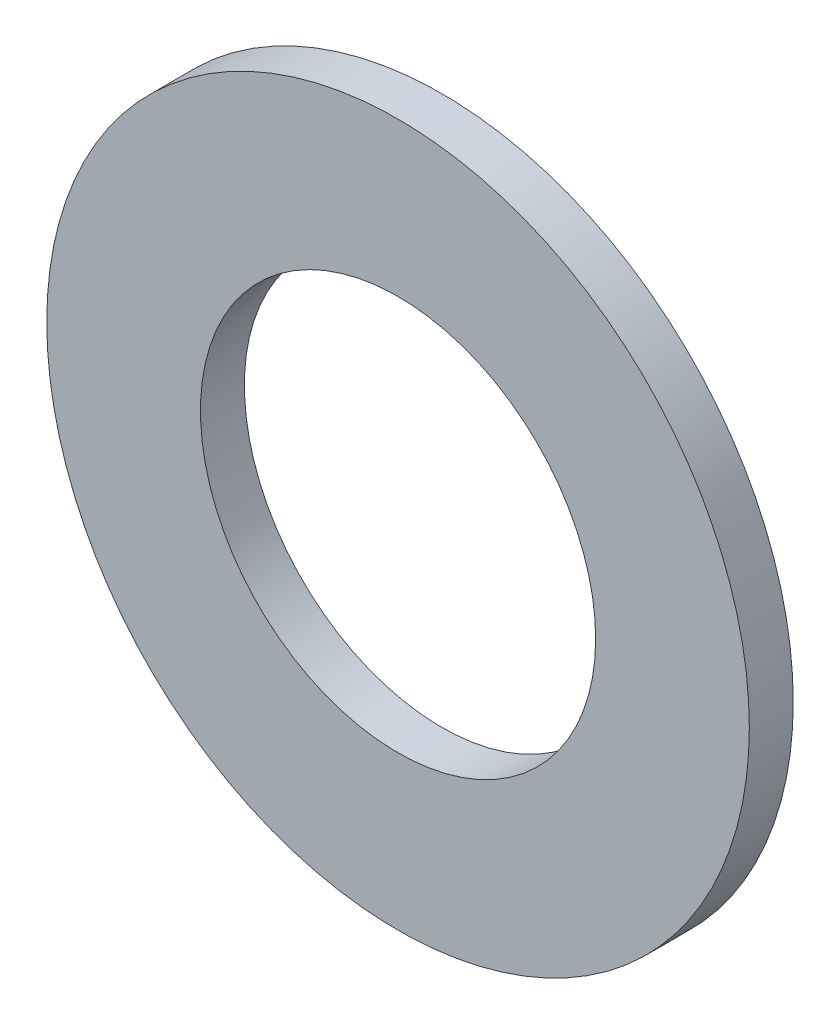
ISO-10303-21;
HEADER;
FILE_DESCRIPTION(('STEP AP214'),'2;1');
FILE_NAME('part.step','',(''),(''),'','','');
FILE_SCHEMA(('AUTOMOTIVE_DESIGN { 1 0 10303 214 1 1 1 1 }'));
ENDSEC;
DATA;
#1=APPLICATION_CONTEXT('core data for automotive mechanical design processes');
#2=APPLICATION_PROTOCOL_DEFINITION('international standard','automotive_design',2000,#1);
#3=PRODUCT_CONTEXT('',#1,'mechanical');
#4=PRODUCT('Part','Part','',(#3));
#5=PRODUCT_RELATED_PRODUCT_CATEGORY('part','',(#4));
#6=PRODUCT_DEFINITION_FORMATION('','',#4);
#7=PRODUCT_DEFINITION_CONTEXT('part definition',#1,'design');
#8=PRODUCT_DEFINITION('design','',#6,#7);
#9=PRODUCT_DEFINITION_SHAPE('','',#8);
#10=(LENGTH_UNIT() NAMED_UNIT(*) SI_UNIT(.MILLI.,.METRE.));
#11=(NAMED_UNIT(*) PLANE_ANGLE_UNIT() SI_UNIT($,.RADIAN.));
#12=(NAMED_UNIT(*) SI_UNIT($,.STERADIAN.) SOLID_ANGLE_UNIT());
#13=UNCERTAINTY_MEASURE_WITH_UNIT(LENGTH_MEASURE(1.E-05),#10,'distance_accuracy_value','');
#14=(GEOMETRIC_REPRESENTATION_CONTEXT(3) GLOBAL_UNCERTAINTY_ASSIGNED_CONTEXT((#13)) GLOBAL_UNIT_ASSIGNED_CONTEXT((#10,
#11,#12)) REPRESENTATION_CONTEXT('',''));
#15=CARTESIAN_POINT('',(0.,0.,0.));
#16=DIRECTION('',(0.,0.,1.));
#17=DIRECTION('',(1.,0.,0.));
#18=AXIS2_PLACEMENT_3D('',#15,#16,#17);
#19=CARTESIAN_POINT('',(0.,0.,1.));
#20=DIRECTION('',(0.,0.,1.));
#21=DIRECTION('',(1.,0.,0.));
#22=AXIS2_PLACEMENT_3D('',#19,#20,#21);
#23=PLANE('',#22);
#24=CARTESIAN_POINT('',(0.,0.,1.));
#25=DIRECTION('',(0.,0.,1.));
#26=DIRECTION('',(1.,0.,0.));
#27=AXIS2_PLACEMENT_3D('',#24,#25,#26);
#28=CIRCLE('',#27,8.);
#29=CARTESIAN_POINT('',(8.,0.,1.));
#30=VERTEX_POINT('',#29);
#31=EDGE_CURVE('E10',#30,#30,#28,.T.);
#32=ORIENTED_EDGE('',*,*,#31,.T.);
#33=EDGE_LOOP('',(#32));
#34=FACE_BOUND('',#33,.T.);
#35=CARTESIAN_POINT('',(0.,0.,1.));
#36=DIRECTION('',(0.,0.,1.));
#37=DIRECTION('',(1.,0.,0.));
#38=AXIS2_PLACEMENT_3D('',#35,#36,#37);
#39=CIRCLE('',#38,4.5);
#40=CARTESIAN_POINT('',(4.5,0.,1.));
#41=VERTEX_POINT('',#40);
#42=EDGE_CURVE('E42',#41,#41,#39,.T.);
#43=ORIENTED_EDGE('',*,*,#42,.F.);
#44=EDGE_LOOP('',(#43));
#45=FACE_BOUND('',#44,.T.);
#46=ADVANCED_FACE('F31',(#34,#45),#23,.T.);
#47=CARTESIAN_POINT('',(0.,0.,0.));
#48=DIRECTION('',(0.,0.,1.));
#49=DIRECTION('',(1.,0.,0.));
#50=AXIS2_PLACEMENT_3D('',#47,#48,#49);
#51=PLANE('',#50);
#52=CARTESIAN_POINT('',(0.,0.,0.));
#53=DIRECTION('',(0.,0.,1.));
#54=DIRECTION('',(1.,0.,0.));
#55=AXIS2_PLACEMENT_3D('',#52,#53,#54);
#56=CIRCLE('',#55,8.);
#57=CARTESIAN_POINT('',(8.,0.,0.));
#58=VERTEX_POINT('',#57);
#59=EDGE_CURVE('E35',#58,#58,#56,.T.);
#60=ORIENTED_EDGE('',*,*,#59,.F.);
#61=EDGE_LOOP('',(#60));
#62=FACE_BOUND('',#61,.T.);
#63=CARTESIAN_POINT('',(0.,0.,0.));
#64=DIRECTION('',(0.,0.,1.));
#65=DIRECTION('',(1.,0.,0.));
#66=AXIS2_PLACEMENT_3D('',#63,#64,#65);
#67=CIRCLE('',#66,4.5);
#68=CARTESIAN_POINT('',(4.5,0.,0.));
#69=VERTEX_POINT('',#68);
#70=EDGE_CURVE('E44',#69,#69,#67,.T.);
#71=ORIENTED_EDGE('',*,*,#70,.T.);
#72=EDGE_LOOP('',(#71));
#73=FACE_BOUND('',#72,.T.);
#74=ADVANCED_FACE('F54',(#62,#73),#51,.F.);
#75=CARTESIAN_POINT('',(0.,0.,1.));
#76=DIRECTION('',(0.,0.,-1.));
#77=DIRECTION('',(-1.,0.,0.));
#78=AXIS2_PLACEMENT_3D('',#75,#76,#77);
#79=CYLINDRICAL_SURFACE('',#78,8.);
#80=ORIENTED_EDGE('',*,*,#31,.F.);
#81=EDGE_LOOP('',(#80));
#82=FACE_BOUND('',#81,.T.);
#83=ORIENTED_EDGE('',*,*,#59,.T.);
#84=EDGE_LOOP('',(#83));
#85=FACE_BOUND('',#84,.T.);
#86=ADVANCED_FACE('F33',(#82,#85),#79,.T.);
#87=CARTESIAN_POINT('',(0.,0.,1.));
#88=DIRECTION('',(0.,0.,-1.));
#89=DIRECTION('',(-1.,0.,0.));
#90=AXIS2_PLACEMENT_3D('',#87,#88,#89);
#91=CYLINDRICAL_SURFACE('',#90,4.5);
#92=ORIENTED_EDGE('',*,*,#42,.T.);
#93=EDGE_LOOP('',(#92));
#94=FACE_BOUND('',#93,.T.);
#95=ORIENTED_EDGE('',*,*,#70,.F.);
#96=EDGE_LOOP('',(#95));
#97=FACE_BOUND('',#96,.T.);
#98=ADVANCED_FACE('F50',(#94,#97),#91,.F.);
#99=CLOSED_SHELL('',(#46,#74,#86,#98));
#100=MANIFOLD_SOLID_BREP('B2',#99);
#101=ADVANCED_BREP_SHAPE_REPRESENTATION('',(#18,#100),#14);
#102=SHAPE_DEFINITION_REPRESENTATION(#9,#101);
ENDSEC;
END-ISO-10303-21;
